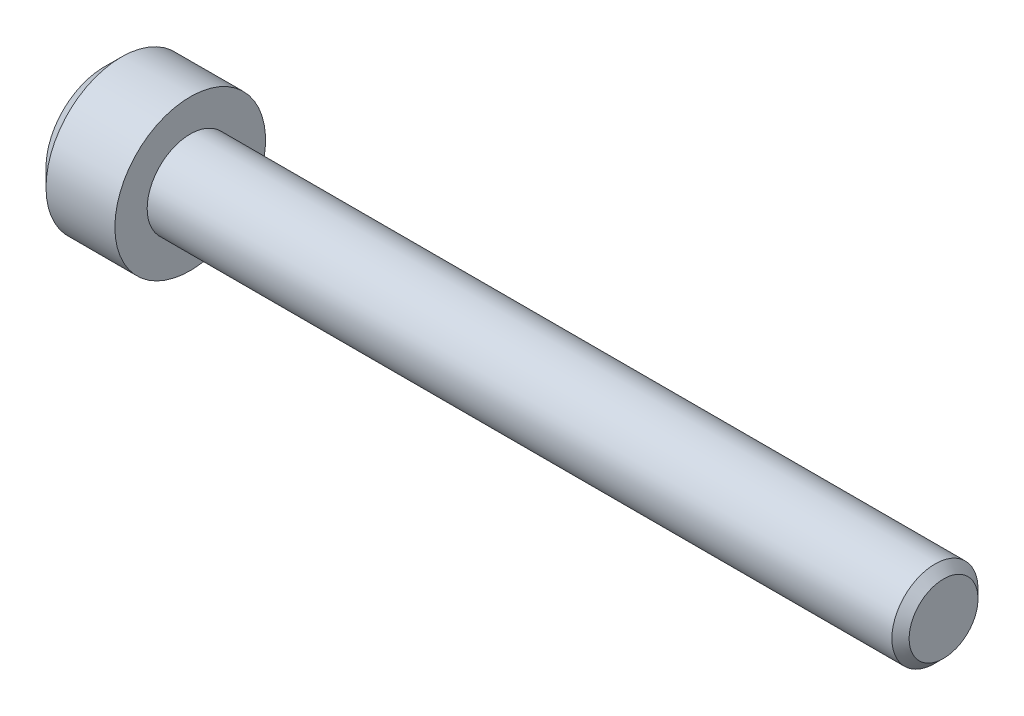
ISO-10303-21;
HEADER;
FILE_DESCRIPTION(('STEP AP214'),'2;1');
FILE_NAME('part.step','',(''),(''),'','','');
FILE_SCHEMA(('AUTOMOTIVE_DESIGN { 1 0 10303 214 1 1 1 1 }'));
ENDSEC;
DATA;
#1=APPLICATION_CONTEXT('core data for automotive mechanical design processes');
#2=APPLICATION_PROTOCOL_DEFINITION('international standard','automotive_design',2000,#1);
#3=PRODUCT_CONTEXT('',#1,'mechanical');
#4=PRODUCT('Part','Part','',(#3));
#5=PRODUCT_RELATED_PRODUCT_CATEGORY('part','',(#4));
#6=PRODUCT_DEFINITION_FORMATION('','',#4);
#7=PRODUCT_DEFINITION_CONTEXT('part definition',#1,'design');
#8=PRODUCT_DEFINITION('design','',#6,#7);
#9=PRODUCT_DEFINITION_SHAPE('','',#8);
#10=(LENGTH_UNIT() NAMED_UNIT(*) SI_UNIT(.MILLI.,.METRE.));
#11=(NAMED_UNIT(*) PLANE_ANGLE_UNIT() SI_UNIT($,.RADIAN.));
#12=(NAMED_UNIT(*) SI_UNIT($,.STERADIAN.) SOLID_ANGLE_UNIT());
#13=UNCERTAINTY_MEASURE_WITH_UNIT(LENGTH_MEASURE(1.E-05),#10,'distance_accuracy_value','');
#14=(GEOMETRIC_REPRESENTATION_CONTEXT(3) GLOBAL_UNCERTAINTY_ASSIGNED_CONTEXT((#13)) GLOBAL_UNIT_ASSIGNED_CONTEXT((#10,
#11,#12)) REPRESENTATION_CONTEXT('',''));
#15=CARTESIAN_POINT('',(0.,0.,0.));
#16=DIRECTION('',(0.,0.,1.));
#17=DIRECTION('',(1.,0.,0.));
#18=AXIS2_PLACEMENT_3D('',#15,#16,#17);
#19=CARTESIAN_POINT('',(0.,0.,0.));
#20=DIRECTION('',(-1.,0.,0.));
#21=DIRECTION('',(0.,0.,1.));
#22=AXIS2_PLACEMENT_3D('',#19,#20,#21);
#23=PLANE('',#22);
#24=CARTESIAN_POINT('',(0.,0.,0.));
#25=DIRECTION('',(-1.,0.,0.));
#26=DIRECTION('',(0.,0.,1.));
#27=AXIS2_PLACEMENT_3D('',#24,#25,#26);
#28=CIRCLE('',#27,1.59999999999999);
#29=CARTESIAN_POINT('',(0.,0.,1.59999999999999));
#30=VERTEX_POINT('',#29);
#31=EDGE_CURVE('E158',#30,#30,#28,.F.);
#32=ORIENTED_EDGE('',*,*,#31,.T.);
#33=EDGE_LOOP('',(#32));
#34=FACE_BOUND('',#33,.T.);
#35=ADVANCED_FACE('F51',(#34),#23,.F.);
#36=CARTESIAN_POINT('',(0.,0.,0.));
#37=DIRECTION('',(-1.,0.,0.));
#38=DIRECTION('',(0.,0.,1.));
#39=AXIS2_PLACEMENT_3D('',#36,#37,#38);
#40=CYLINDRICAL_SURFACE('',#39,2.);
#41=CARTESIAN_POINT('',(-0.399999999999956,0.,0.));
#42=DIRECTION('',(-1.,0.,0.));
#43=DIRECTION('',(0.,0.,1.));
#44=AXIS2_PLACEMENT_3D('',#41,#42,#43);
#45=CIRCLE('',#44,2.);
#46=CARTESIAN_POINT('',(-0.399999999999956,0.,2.));
#47=VERTEX_POINT('',#46);
#48=EDGE_CURVE('E154',#47,#47,#45,.T.);
#49=ORIENTED_EDGE('',*,*,#48,.T.);
#50=EDGE_LOOP('',(#49));
#51=FACE_BOUND('',#50,.T.);
#52=CARTESIAN_POINT('',(-34.9999999999999,2.22044604925031E-13,0.));
#53=DIRECTION('',(-1.,0.,0.));
#54=DIRECTION('',(0.,0.,1.));
#55=AXIS2_PLACEMENT_3D('',#52,#53,#54);
#56=CIRCLE('',#55,2.);
#57=CARTESIAN_POINT('',(-34.9999999999999,2.22044604925031E-13,2.));
#58=VERTEX_POINT('',#57);
#59=EDGE_CURVE('E150',#58,#58,#56,.T.);
#60=ORIENTED_EDGE('',*,*,#59,.F.);
#61=EDGE_LOOP('',(#60));
#62=FACE_BOUND('',#61,.T.);
#63=ADVANCED_FACE('F184',(#51,#62),#40,.T.);
#64=CARTESIAN_POINT('',(-34.9999999999999,2.00000000000022,0.));
#65=DIRECTION('',(-1.,0.,0.));
#66=DIRECTION('',(0.,0.,1.));
#67=AXIS2_PLACEMENT_3D('',#64,#65,#66);
#68=PLANE('',#67);
#69=CARTESIAN_POINT('',(-34.9999999999999,2.22044604925031E-13,0.));
#70=DIRECTION('',(-1.,0.,0.));
#71=DIRECTION('',(0.,0.,1.));
#72=AXIS2_PLACEMENT_3D('',#69,#70,#71);
#73=CIRCLE('',#72,3.5);
#74=CARTESIAN_POINT('',(-34.9999999999999,2.22044604925031E-13,3.5));
#75=VERTEX_POINT('',#74);
#76=EDGE_CURVE('E134',#75,#75,#73,.T.);
#77=ORIENTED_EDGE('',*,*,#76,.F.);
#78=EDGE_LOOP('',(#77));
#79=FACE_BOUND('',#78,.T.);
#80=ORIENTED_EDGE('',*,*,#59,.T.);
#81=EDGE_LOOP('',(#80));
#82=FACE_BOUND('',#81,.T.);
#83=ADVANCED_FACE('F190',(#79,#82),#68,.F.);
#84=CARTESIAN_POINT('',(0.,0.,0.));
#85=DIRECTION('',(-1.,0.,0.));
#86=DIRECTION('',(0.,0.,1.));
#87=AXIS2_PLACEMENT_3D('',#84,#85,#86);
#88=CYLINDRICAL_SURFACE('',#87,3.5);
#89=CARTESIAN_POINT('',(-38.2,-2.44249065417534E-12,0.));
#90=DIRECTION('',(1.,0.,0.));
#91=DIRECTION('',(0.,0.,-1.));
#92=AXIS2_PLACEMENT_3D('',#89,#90,#91);
#93=CIRCLE('',#92,3.5);
#94=CARTESIAN_POINT('',(-38.2,-2.44249065417534E-12,-3.5));
#95=VERTEX_POINT('',#94);
#96=EDGE_CURVE('E11',#95,#95,#93,.T.);
#97=ORIENTED_EDGE('',*,*,#96,.T.);
#98=EDGE_LOOP('',(#97));
#99=FACE_BOUND('',#98,.T.);
#100=ORIENTED_EDGE('',*,*,#76,.T.);
#101=EDGE_LOOP('',(#100));
#102=FACE_BOUND('',#101,.T.);
#103=ADVANCED_FACE('F203',(#99,#102),#88,.T.);
#104=CARTESIAN_POINT('',(-38.9999999999996,3.49999999999739,0.));
#105=DIRECTION('',(1.,0.,0.));
#106=DIRECTION('',(0.,0.,-1.));
#107=AXIS2_PLACEMENT_3D('',#104,#105,#106);
#108=PLANE('',#107);
#109=CARTESIAN_POINT('',(-38.9999999999999,-2.44249065417534E-12,0.));
#110=DIRECTION('',(1.,0.,0.));
#111=DIRECTION('',(0.,0.,-1.));
#112=AXIS2_PLACEMENT_3D('',#109,#110,#111);
#113=CIRCLE('',#112,2.7);
#114=CARTESIAN_POINT('',(-38.9999999999999,-2.44249065417534E-12,-2.7));
#115=VERTEX_POINT('',#114);
#116=EDGE_CURVE('E60',#115,#115,#113,.F.);
#117=ORIENTED_EDGE('',*,*,#116,.T.);
#118=EDGE_LOOP('',(#117));
#119=FACE_BOUND('',#118,.T.);
#120=DIRECTION('',(0.,-0.500000000000002,-0.866025403784439));
#121=VECTOR('',#120,1.);
#122=CARTESIAN_POINT('',(-38.9999999999999,1.73205080756644,0.));
#123=LINE('',#122,#121);
#124=CARTESIAN_POINT('',(-38.9999999999999,1.73205080756644,0.));
#125=VERTEX_POINT('',#124);
#126=CARTESIAN_POINT('',(-38.9999999999999,0.866025403782,-1.49999999999995));
#127=VERTEX_POINT('',#126);
#128=EDGE_CURVE('E428',#125,#127,#123,.T.);
#129=ORIENTED_EDGE('',*,*,#128,.F.);
#130=DIRECTION('',(0.,0.500000000000002,-0.866025403784439));
#131=VECTOR('',#130,1.);
#132=CARTESIAN_POINT('',(-38.9999999999999,0.866025403782,1.49999999999995));
#133=LINE('',#132,#131);
#134=CARTESIAN_POINT('',(-38.9999999999999,0.866025403782,1.49999999999995));
#135=VERTEX_POINT('',#134);
#136=EDGE_CURVE('E67',#135,#125,#133,.T.);
#137=ORIENTED_EDGE('',*,*,#136,.F.);
#138=DIRECTION('',(0.,1.,0.));
#139=VECTOR('',#138,1.);
#140=CARTESIAN_POINT('',(-38.9999999999999,-0.866025403786885,1.49999999999995));
#141=LINE('',#140,#139);
#142=CARTESIAN_POINT('',(-38.9999999999999,-0.866025403786885,1.49999999999995));
#143=VERTEX_POINT('',#142);
#144=EDGE_CURVE('E102',#143,#135,#141,.T.);
#145=ORIENTED_EDGE('',*,*,#144,.F.);
#146=DIRECTION('',(0.,0.500000000000002,0.866025403784439));
#147=VECTOR('',#146,1.);
#148=CARTESIAN_POINT('',(-38.9999999999999,-1.73205080757133,0.));
#149=LINE('',#148,#147);
#150=CARTESIAN_POINT('',(-38.9999999999999,-1.73205080757133,0.));
#151=VERTEX_POINT('',#150);
#152=EDGE_CURVE('E111',#151,#143,#149,.T.);
#153=ORIENTED_EDGE('',*,*,#152,.F.);
#154=DIRECTION('',(0.,-0.500000000000003,0.866025403784438));
#155=VECTOR('',#154,1.);
#156=CARTESIAN_POINT('',(-38.9999999999999,-0.866025403786885,-1.49999999999995));
#157=LINE('',#156,#155);
#158=CARTESIAN_POINT('',(-38.9999999999999,-0.866025403786885,-1.49999999999995));
#159=VERTEX_POINT('',#158);
#160=EDGE_CURVE('E118',#159,#151,#157,.T.);
#161=ORIENTED_EDGE('',*,*,#160,.F.);
#162=DIRECTION('',(0.,-1.,0.));
#163=VECTOR('',#162,1.);
#164=CARTESIAN_POINT('',(-38.9999999999999,0.866025403782,-1.49999999999995));
#165=LINE('',#164,#163);
#166=EDGE_CURVE('E432',#127,#159,#165,.T.);
#167=ORIENTED_EDGE('',*,*,#166,.F.);
#168=EDGE_LOOP('',(#129,#137,#145,#153,#161,#167));
#169=FACE_BOUND('',#168,.T.);
#170=ADVANCED_FACE('F121',(#119,#169),#108,.F.);
#171=CARTESIAN_POINT('',(-0.399999999999956,0.,0.));
#172=DIRECTION('',(-1.,0.,0.));
#173=DIRECTION('',(0.,0.,1.));
#174=AXIS2_PLACEMENT_3D('',#171,#172,#173);
#175=CONICAL_SURFACE('',#174,2.,0.785398163397453);
#176=ORIENTED_EDGE('',*,*,#31,.F.);
#177=EDGE_LOOP('',(#176));
#178=FACE_BOUND('',#177,.T.);
#179=ORIENTED_EDGE('',*,*,#48,.F.);
#180=EDGE_LOOP('',(#179));
#181=FACE_BOUND('',#180,.T.);
#182=ADVANCED_FACE('F194',(#178,#181),#175,.T.);
#183=CARTESIAN_POINT('',(-36.9999999999999,0.866025403784665,1.49999999999995));
#184=DIRECTION('',(0.,0.866025403784444,0.5));
#185=DIRECTION('',(0.,-0.500000000000002,0.866025403784439));
#186=AXIS2_PLACEMENT_3D('',#183,#184,#185);
#187=PLANE('',#186);
#188=ORIENTED_EDGE('',*,*,#136,.T.);
#189=DIRECTION('',(-1.,0.,0.));
#190=VECTOR('',#189,1.);
#191=CARTESIAN_POINT('',(-36.9999999999999,1.73205080756911,0.));
#192=LINE('',#191,#190);
#193=CARTESIAN_POINT('',(-36.9999999999999,1.73205080756911,0.));
#194=VERTEX_POINT('',#193);
#195=EDGE_CURVE('E144',#194,#125,#192,.T.);
#196=ORIENTED_EDGE('',*,*,#195,.F.);
#197=DIRECTION('',(0.,0.500000000000002,-0.866025403784439));
#198=VECTOR('',#197,1.);
#199=CARTESIAN_POINT('',(-36.9999999999999,0.866025403784665,1.49999999999995));
#200=LINE('',#199,#198);
#201=CARTESIAN_POINT('',(-36.9999999999999,0.866025403784665,1.49999999999995));
#202=VERTEX_POINT('',#201);
#203=EDGE_CURVE('E123',#202,#194,#200,.T.);
#204=ORIENTED_EDGE('',*,*,#203,.F.);
#205=DIRECTION('',(-1.,0.,0.));
#206=VECTOR('',#205,1.);
#207=CARTESIAN_POINT('',(-36.9999999999999,0.866025403784665,1.49999999999995));
#208=LINE('',#207,#206);
#209=EDGE_CURVE('E107',#202,#135,#208,.T.);
#210=ORIENTED_EDGE('',*,*,#209,.T.);
#211=EDGE_LOOP('',(#188,#196,#204,#210));
#212=FACE_BOUND('',#211,.T.);
#213=ADVANCED_FACE('F196',(#212),#187,.F.);
#214=CARTESIAN_POINT('',(-36.9999999999999,-0.866025403784221,1.49999999999995));
#215=DIRECTION('',(0.,0.,1.));
#216=DIRECTION('',(0.,-1.,0.));
#217=AXIS2_PLACEMENT_3D('',#214,#215,#216);
#218=PLANE('',#217);
#219=ORIENTED_EDGE('',*,*,#144,.T.);
#220=ORIENTED_EDGE('',*,*,#209,.F.);
#221=DIRECTION('',(0.,1.,0.));
#222=VECTOR('',#221,1.);
#223=CARTESIAN_POINT('',(-36.9999999999999,-0.866025403784221,1.49999999999995));
#224=LINE('',#223,#222);
#225=CARTESIAN_POINT('',(-36.9999999999999,-0.866025403784221,1.49999999999995));
#226=VERTEX_POINT('',#225);
#227=EDGE_CURVE('E104',#226,#202,#224,.T.);
#228=ORIENTED_EDGE('',*,*,#227,.F.);
#229=DIRECTION('',(-1.,0.,0.));
#230=VECTOR('',#229,1.);
#231=CARTESIAN_POINT('',(-36.9999999999999,-0.866025403784221,1.49999999999995));
#232=LINE('',#231,#230);
#233=EDGE_CURVE('E97',#226,#143,#232,.T.);
#234=ORIENTED_EDGE('',*,*,#233,.T.);
#235=EDGE_LOOP('',(#219,#220,#228,#234));
#236=FACE_BOUND('',#235,.T.);
#237=ADVANCED_FACE('F99',(#236),#218,.F.);
#238=CARTESIAN_POINT('',(-36.9999999999999,-1.73205080756866,0.));
#239=DIRECTION('',(0.,-0.866025403784444,0.5));
#240=DIRECTION('',(0.,-0.500000000000002,-0.866025403784439));
#241=AXIS2_PLACEMENT_3D('',#238,#239,#240);
#242=PLANE('',#241);
#243=ORIENTED_EDGE('',*,*,#152,.T.);
#244=ORIENTED_EDGE('',*,*,#233,.F.);
#245=DIRECTION('',(0.,0.500000000000002,0.866025403784439));
#246=VECTOR('',#245,1.);
#247=CARTESIAN_POINT('',(-36.9999999999999,-1.73205080756866,0.));
#248=LINE('',#247,#246);
#249=CARTESIAN_POINT('',(-36.9999999999999,-1.73205080756866,0.));
#250=VERTEX_POINT('',#249);
#251=EDGE_CURVE('E76',#250,#226,#248,.T.);
#252=ORIENTED_EDGE('',*,*,#251,.F.);
#253=DIRECTION('',(-1.,0.,0.));
#254=VECTOR('',#253,1.);
#255=CARTESIAN_POINT('',(-36.9999999999999,-1.73205080756866,0.));
#256=LINE('',#255,#254);
#257=EDGE_CURVE('E108',#250,#151,#256,.T.);
#258=ORIENTED_EDGE('',*,*,#257,.T.);
#259=EDGE_LOOP('',(#243,#244,#252,#258));
#260=FACE_BOUND('',#259,.T.);
#261=ADVANCED_FACE('F112',(#260),#242,.F.);
#262=CARTESIAN_POINT('',(-36.9999999999999,-0.866025403784221,-1.49999999999995));
#263=DIRECTION('',(0.,-0.866025403784444,-0.5));
#264=DIRECTION('',(0.,0.500000000000003,-0.866025403784438));
#265=AXIS2_PLACEMENT_3D('',#262,#263,#264);
#266=PLANE('',#265);
#267=ORIENTED_EDGE('',*,*,#160,.T.);
#268=ORIENTED_EDGE('',*,*,#257,.F.);
#269=DIRECTION('',(0.,-0.500000000000003,0.866025403784438));
#270=VECTOR('',#269,1.);
#271=CARTESIAN_POINT('',(-36.9999999999999,-0.866025403784221,-1.49999999999995));
#272=LINE('',#271,#270);
#273=CARTESIAN_POINT('',(-36.9999999999999,-0.866025403784221,-1.49999999999995));
#274=VERTEX_POINT('',#273);
#275=EDGE_CURVE('E421',#274,#250,#272,.T.);
#276=ORIENTED_EDGE('',*,*,#275,.F.);
#277=DIRECTION('',(-1.,0.,0.));
#278=VECTOR('',#277,1.);
#279=CARTESIAN_POINT('',(-36.9999999999999,-0.866025403784221,-1.49999999999995));
#280=LINE('',#279,#278);
#281=EDGE_CURVE('E138',#274,#159,#280,.T.);
#282=ORIENTED_EDGE('',*,*,#281,.T.);
#283=EDGE_LOOP('',(#267,#268,#276,#282));
#284=FACE_BOUND('',#283,.T.);
#285=ADVANCED_FACE('F222',(#284),#266,.F.);
#286=CARTESIAN_POINT('',(-36.9999999999999,0.866025403784665,-1.49999999999995));
#287=DIRECTION('',(0.,0.,-1.));
#288=DIRECTION('',(-1.,0.,0.));
#289=AXIS2_PLACEMENT_3D('',#286,#287,#288);
#290=PLANE('',#289);
#291=ORIENTED_EDGE('',*,*,#166,.T.);
#292=ORIENTED_EDGE('',*,*,#281,.F.);
#293=DIRECTION('',(0.,-1.,0.));
#294=VECTOR('',#293,1.);
#295=CARTESIAN_POINT('',(-36.9999999999999,0.866025403784665,-1.49999999999995));
#296=LINE('',#295,#294);
#297=CARTESIAN_POINT('',(-36.9999999999999,0.866025403784665,-1.49999999999995));
#298=VERTEX_POINT('',#297);
#299=EDGE_CURVE('E418',#298,#274,#296,.T.);
#300=ORIENTED_EDGE('',*,*,#299,.F.);
#301=DIRECTION('',(-1.,0.,0.));
#302=VECTOR('',#301,1.);
#303=CARTESIAN_POINT('',(-36.9999999999999,0.866025403784665,-1.49999999999995));
#304=LINE('',#303,#302);
#305=EDGE_CURVE('E141',#298,#127,#304,.T.);
#306=ORIENTED_EDGE('',*,*,#305,.T.);
#307=EDGE_LOOP('',(#291,#292,#300,#306));
#308=FACE_BOUND('',#307,.T.);
#309=ADVANCED_FACE('F179',(#308),#290,.F.);
#310=CARTESIAN_POINT('',(-36.9999999999999,1.73205080756911,0.));
#311=DIRECTION('',(0.,0.866025403784444,-0.5));
#312=DIRECTION('',(0.,0.500000000000002,0.866025403784439));
#313=AXIS2_PLACEMENT_3D('',#310,#311,#312);
#314=PLANE('',#313);
#315=ORIENTED_EDGE('',*,*,#128,.T.);
#316=ORIENTED_EDGE('',*,*,#305,.F.);
#317=DIRECTION('',(0.,-0.500000000000002,-0.866025403784439));
#318=VECTOR('',#317,1.);
#319=CARTESIAN_POINT('',(-36.9999999999999,1.73205080756911,0.));
#320=LINE('',#319,#318);
#321=EDGE_CURVE('E129',#194,#298,#320,.T.);
#322=ORIENTED_EDGE('',*,*,#321,.F.);
#323=ORIENTED_EDGE('',*,*,#195,.T.);
#324=EDGE_LOOP('',(#315,#316,#322,#323));
#325=FACE_BOUND('',#324,.T.);
#326=ADVANCED_FACE('F170',(#325),#314,.F.);
#327=CARTESIAN_POINT('',(-38.9999999999999,-2.44249065417534E-12,0.));
#328=DIRECTION('',(1.,0.,0.));
#329=DIRECTION('',(0.,0.,-1.));
#330=AXIS2_PLACEMENT_3D('',#327,#328,#329);
#331=CONICAL_SURFACE('',#330,2.7,0.785398163397449);
#332=ORIENTED_EDGE('',*,*,#96,.F.);
#333=EDGE_LOOP('',(#332));
#334=FACE_BOUND('',#333,.T.);
#335=ORIENTED_EDGE('',*,*,#116,.F.);
#336=EDGE_LOOP('',(#335));
#337=FACE_BOUND('',#336,.T.);
#338=ADVANCED_FACE('F53',(#334,#337),#331,.T.);
#339=CARTESIAN_POINT('',(-36.9999999999999,-0.866025403784221,-1.49999999999995));
#340=DIRECTION('',(0.857167300702118,-0.44603605678834,-0.257519037455026));
#341=DIRECTION('',(0.461604487477354,0.887085845417894,0.));
#342=AXIS2_PLACEMENT_3D('',#339,#340,#341);
#343=PLANE('',#342);
#344=ORIENTED_EDGE('',*,*,#275,.T.);
#345=DIRECTION('',(-0.461604487477355,-0.887085845417894,0.));
#346=VECTOR('',#345,1.);
#347=CARTESIAN_POINT('',(-36.6453774867055,-1.05055697346579,0.));
#348=LINE('',#347,#346);
#349=CARTESIAN_POINT('',(-36.0987090714586,2.22044604925031E-13,0.));
#350=VERTEX_POINT('',#349);
#351=EDGE_CURVE('E442',#350,#250,#348,.T.);
#352=ORIENTED_EDGE('',*,*,#351,.F.);
#353=DIRECTION('',(-0.461604487477355,-0.443542922708947,-0.768238877469488));
#354=VECTOR('',#353,1.);
#355=CARTESIAN_POINT('',(-36.6453774867055,-0.525278486732894,-0.909809027144437));
#356=LINE('',#355,#354);
#357=EDGE_CURVE('E402',#350,#274,#356,.T.);
#358=ORIENTED_EDGE('',*,*,#357,.T.);
#359=EDGE_LOOP('',(#344,#352,#358));
#360=FACE_BOUND('',#359,.T.);
#361=ADVANCED_FACE('F169',(#360),#343,.F.);
#362=CARTESIAN_POINT('',(-36.9999999999999,0.866025403784665,-1.49999999999995));
#363=DIRECTION('',(0.857167300702118,0.,-0.515038074910052));
#364=DIRECTION('',(-0.515038074910055,0.,-0.857167300702113));
#365=AXIS2_PLACEMENT_3D('',#362,#363,#364);
#366=PLANE('',#365);
#367=ORIENTED_EDGE('',*,*,#299,.T.);
#368=ORIENTED_EDGE('',*,*,#357,.F.);
#369=DIRECTION('',(-0.461604487477355,0.443542922708947,-0.768238877469487));
#370=VECTOR('',#369,1.);
#371=CARTESIAN_POINT('',(-36.6453774867055,0.525278486733116,-0.909809027144437));
#372=LINE('',#371,#370);
#373=EDGE_CURVE('E404',#350,#298,#372,.T.);
#374=ORIENTED_EDGE('',*,*,#373,.T.);
#375=EDGE_LOOP('',(#367,#368,#374));
#376=FACE_BOUND('',#375,.T.);
#377=ADVANCED_FACE('F176',(#376),#366,.F.);
#378=CARTESIAN_POINT('',(-36.9999999999999,1.73205080756911,0.));
#379=DIRECTION('',(0.857167300702118,0.446036056788341,-0.257519037455026));
#380=DIRECTION('',(-0.461604487477355,0.887085845417894,0.));
#381=AXIS2_PLACEMENT_3D('',#378,#379,#380);
#382=PLANE('',#381);
#383=ORIENTED_EDGE('',*,*,#321,.T.);
#384=ORIENTED_EDGE('',*,*,#373,.F.);
#385=DIRECTION('',(-0.461604487477355,0.887085845417894,0.));
#386=VECTOR('',#385,1.);
#387=CARTESIAN_POINT('',(-36.6453774867055,1.05055697346623,0.));
#388=LINE('',#387,#386);
#389=EDGE_CURVE('E389',#350,#194,#388,.T.);
#390=ORIENTED_EDGE('',*,*,#389,.T.);
#391=EDGE_LOOP('',(#383,#384,#390));
#392=FACE_BOUND('',#391,.T.);
#393=ADVANCED_FACE('F233',(#392),#382,.F.);
#394=CARTESIAN_POINT('',(-36.9999999999999,0.866025403784665,1.49999999999995));
#395=DIRECTION('',(0.857167300702118,0.44603605678834,0.257519037455026));
#396=DIRECTION('',(-0.461604487477354,0.887085845417894,0.));
#397=AXIS2_PLACEMENT_3D('',#394,#395,#396);
#398=PLANE('',#397);
#399=ORIENTED_EDGE('',*,*,#203,.T.);
#400=ORIENTED_EDGE('',*,*,#389,.F.);
#401=DIRECTION('',(-0.461604487477355,0.443542922708947,0.768238877469488));
#402=VECTOR('',#401,1.);
#403=CARTESIAN_POINT('',(-36.6453774867055,0.525278486733116,0.909809027144437));
#404=LINE('',#403,#402);
#405=EDGE_CURVE('E378',#350,#202,#404,.T.);
#406=ORIENTED_EDGE('',*,*,#405,.T.);
#407=EDGE_LOOP('',(#399,#400,#406));
#408=FACE_BOUND('',#407,.T.);
#409=ADVANCED_FACE('F237',(#408),#398,.F.);
#410=CARTESIAN_POINT('',(-36.9999999999999,-0.866025403784221,1.49999999999995));
#411=DIRECTION('',(0.857167300702118,0.,0.515038074910052));
#412=DIRECTION('',(0.515038074910055,0.,-0.857167300702113));
#413=AXIS2_PLACEMENT_3D('',#410,#411,#412);
#414=PLANE('',#413);
#415=ORIENTED_EDGE('',*,*,#227,.T.);
#416=ORIENTED_EDGE('',*,*,#405,.F.);
#417=DIRECTION('',(-0.461604487477355,-0.443542922708947,0.768238877469488));
#418=VECTOR('',#417,1.);
#419=CARTESIAN_POINT('',(-36.6453774867055,-0.525278486732894,0.909809027144437));
#420=LINE('',#419,#418);
#421=EDGE_CURVE('E379',#350,#226,#420,.T.);
#422=ORIENTED_EDGE('',*,*,#421,.T.);
#423=EDGE_LOOP('',(#415,#416,#422));
#424=FACE_BOUND('',#423,.T.);
#425=ADVANCED_FACE('F241',(#424),#414,.F.);
#426=CARTESIAN_POINT('',(-36.9999999999999,-1.73205080756866,0.));
#427=DIRECTION('',(0.857167300702118,-0.44603605678834,0.257519037455026));
#428=DIRECTION('',(0.461604487477355,0.887085845417894,0.));
#429=AXIS2_PLACEMENT_3D('',#426,#427,#428);
#430=PLANE('',#429);
#431=ORIENTED_EDGE('',*,*,#251,.T.);
#432=ORIENTED_EDGE('',*,*,#421,.F.);
#433=ORIENTED_EDGE('',*,*,#351,.T.);
#434=EDGE_LOOP('',(#431,#432,#433));
#435=FACE_BOUND('',#434,.T.);
#436=ADVANCED_FACE('F245',(#435),#430,.F.);
#437=CLOSED_SHELL('',(#35,#63,#83,#103,#170,#182,#213,#237,#261,#285,#309,#326,#338,#361,#377,
#393,#409,#425,#436));
#438=MANIFOLD_SOLID_BREP('B2',#437);
#439=ADVANCED_BREP_SHAPE_REPRESENTATION('',(#18,#438),#14);
#440=SHAPE_DEFINITION_REPRESENTATION(#9,#439);
ENDSEC;
END-ISO-10303-21;
